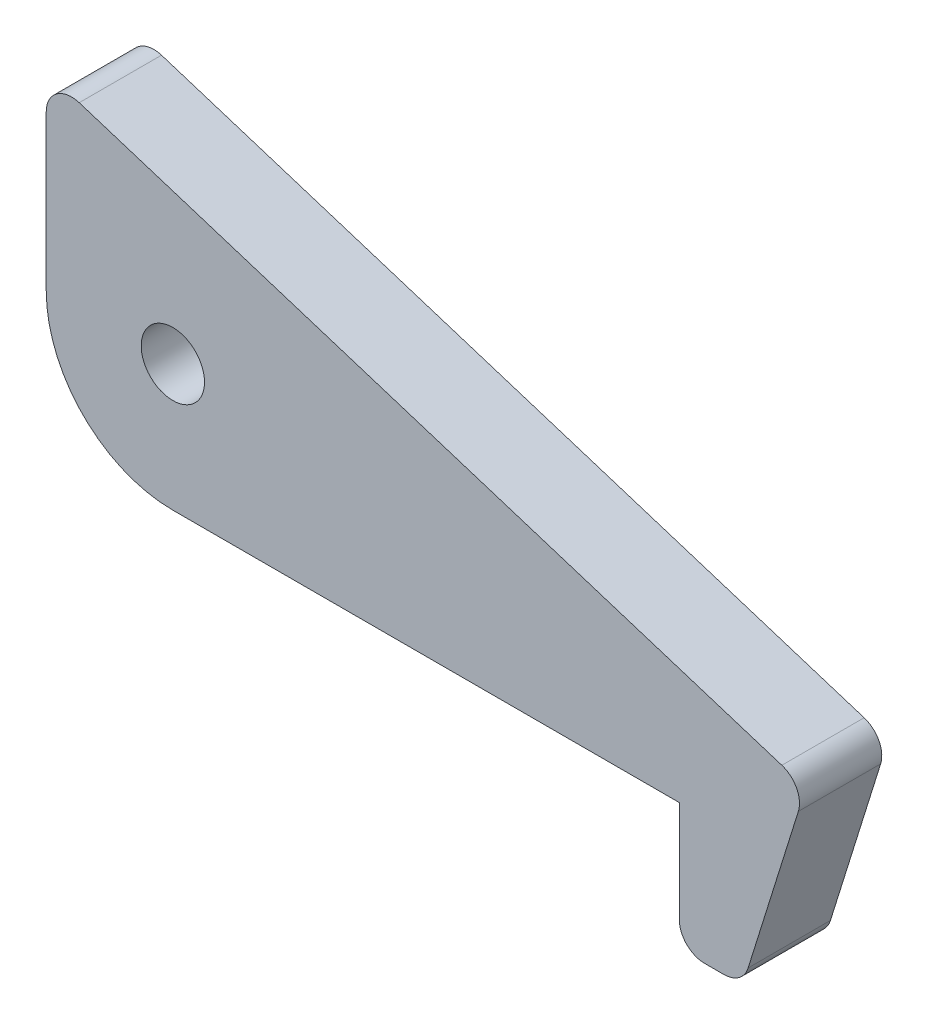
ISO-10303-21;
HEADER;
FILE_DESCRIPTION(('STEP AP214'),'2;1');
FILE_NAME('part.step','',(''),(''),'','','');
FILE_SCHEMA(('AUTOMOTIVE_DESIGN { 1 0 10303 214 1 1 1 1 }'));
ENDSEC;
DATA;
#1=APPLICATION_CONTEXT('core data for automotive mechanical design processes');
#2=APPLICATION_PROTOCOL_DEFINITION('international standard','automotive_design',2000,#1);
#3=PRODUCT_CONTEXT('',#1,'mechanical');
#4=PRODUCT('Part','Part','',(#3));
#5=PRODUCT_RELATED_PRODUCT_CATEGORY('part','',(#4));
#6=PRODUCT_DEFINITION_FORMATION('','',#4);
#7=PRODUCT_DEFINITION_CONTEXT('part definition',#1,'design');
#8=PRODUCT_DEFINITION('design','',#6,#7);
#9=PRODUCT_DEFINITION_SHAPE('','',#8);
#10=(LENGTH_UNIT() NAMED_UNIT(*) SI_UNIT(.MILLI.,.METRE.));
#11=(NAMED_UNIT(*) PLANE_ANGLE_UNIT() SI_UNIT($,.RADIAN.));
#12=(NAMED_UNIT(*) SI_UNIT($,.STERADIAN.) SOLID_ANGLE_UNIT());
#13=UNCERTAINTY_MEASURE_WITH_UNIT(LENGTH_MEASURE(1.E-05),#10,'distance_accuracy_value','');
#14=(GEOMETRIC_REPRESENTATION_CONTEXT(3) GLOBAL_UNCERTAINTY_ASSIGNED_CONTEXT((#13)) GLOBAL_UNIT_ASSIGNED_CONTEXT((#10,
#11,#12)) REPRESENTATION_CONTEXT('',''));
#15=CARTESIAN_POINT('',(0.,0.,0.));
#16=DIRECTION('',(0.,0.,1.));
#17=DIRECTION('',(1.,0.,0.));
#18=AXIS2_PLACEMENT_3D('',#15,#16,#17);
#19=CARTESIAN_POINT('',(0.,0.,6.5));
#20=DIRECTION('',(1.,0.,0.));
#21=DIRECTION('',(0.,0.,-1.));
#22=AXIS2_PLACEMENT_3D('',#19,#20,#21);
#23=PLANE('',#22);
#24=DIRECTION('',(0.,-1.,0.));
#25=VECTOR('',#24,1.);
#26=CARTESIAN_POINT('',(0.,0.,6.5));
#27=LINE('',#26,#25);
#28=CARTESIAN_POINT('',(0.,32.2687841363254,6.5));
#29=VERTEX_POINT('',#28);
#30=CARTESIAN_POINT('',(0.,20.,6.5));
#31=VERTEX_POINT('',#30);
#32=EDGE_CURVE('E144',#29,#31,#27,.T.);
#33=ORIENTED_EDGE('',*,*,#32,.F.);
#34=DIRECTION('',(0.,0.,-1.));
#35=VECTOR('',#34,1.);
#36=CARTESIAN_POINT('',(0.,32.2687841363254,6.5));
#37=LINE('',#36,#35);
#38=CARTESIAN_POINT('',(0.,32.2687841363254,0.));
#39=VERTEX_POINT('',#38);
#40=EDGE_CURVE('E191',#29,#39,#37,.T.);
#41=ORIENTED_EDGE('',*,*,#40,.T.);
#42=DIRECTION('',(0.,-1.,0.));
#43=VECTOR('',#42,1.);
#44=CARTESIAN_POINT('',(0.,0.,0.));
#45=LINE('',#44,#43);
#46=CARTESIAN_POINT('',(0.,20.,0.));
#47=VERTEX_POINT('',#46);
#48=EDGE_CURVE('E134',#39,#47,#45,.T.);
#49=ORIENTED_EDGE('',*,*,#48,.T.);
#50=DIRECTION('',(0.,0.,1.));
#51=VECTOR('',#50,1.);
#52=CARTESIAN_POINT('',(0.,20.,6.5));
#53=LINE('',#52,#51);
#54=EDGE_CURVE('E150',#47,#31,#53,.T.);
#55=ORIENTED_EDGE('',*,*,#54,.T.);
#56=EDGE_LOOP('',(#33,#41,#49,#55));
#57=FACE_BOUND('',#56,.T.);
#58=ADVANCED_FACE('F33',(#57),#23,.F.);
#59=CARTESIAN_POINT('',(0.,0.,6.5));
#60=DIRECTION('',(0.,1.,0.));
#61=DIRECTION('',(0.,0.,1.));
#62=AXIS2_PLACEMENT_3D('',#59,#60,#61);
#63=PLANE('',#62);
#64=DIRECTION('',(1.,0.,0.));
#65=VECTOR('',#64,1.);
#66=CARTESIAN_POINT('',(0.,0.,0.));
#67=LINE('',#66,#65);
#68=CARTESIAN_POINT('',(52.,0.,0.));
#69=VERTEX_POINT('',#68);
#70=CARTESIAN_POINT('',(53.52961817322,0.,0.));
#71=VERTEX_POINT('',#70);
#72=EDGE_CURVE('E147',#69,#71,#67,.T.);
#73=ORIENTED_EDGE('',*,*,#72,.T.);
#74=DIRECTION('',(0.,0.,1.));
#75=VECTOR('',#74,1.);
#76=CARTESIAN_POINT('',(53.52961817322,0.,6.5));
#77=LINE('',#76,#75);
#78=CARTESIAN_POINT('',(53.52961817322,0.,6.5));
#79=VERTEX_POINT('',#78);
#80=EDGE_CURVE('E169',#71,#79,#77,.T.);
#81=ORIENTED_EDGE('',*,*,#80,.T.);
#82=DIRECTION('',(1.,0.,0.));
#83=VECTOR('',#82,1.);
#84=CARTESIAN_POINT('',(0.,0.,6.5));
#85=LINE('',#84,#83);
#86=CARTESIAN_POINT('',(52.,0.,6.5));
#87=VERTEX_POINT('',#86);
#88=EDGE_CURVE('E146',#87,#79,#85,.T.);
#89=ORIENTED_EDGE('',*,*,#88,.F.);
#90=DIRECTION('',(0.,0.,1.));
#91=VECTOR('',#90,1.);
#92=CARTESIAN_POINT('',(52.,0.,6.5));
#93=LINE('',#92,#91);
#94=EDGE_CURVE('E165',#87,#69,#93,.F.);
#95=ORIENTED_EDGE('',*,*,#94,.T.);
#96=EDGE_LOOP('',(#73,#81,#89,#95));
#97=FACE_BOUND('',#96,.T.);
#98=ADVANCED_FACE('F219',(#97),#63,.F.);
#99=CARTESIAN_POINT('',(0.,0.,6.5));
#100=DIRECTION('',(0.,0.,-1.));
#101=DIRECTION('',(-1.,0.,0.));
#102=AXIS2_PLACEMENT_3D('',#99,#100,#101);
#103=PLANE('',#102);
#104=CARTESIAN_POINT('',(10.,20.,6.5));
#105=DIRECTION('',(0.,0.,1.));
#106=DIRECTION('',(1.,0.,0.));
#107=AXIS2_PLACEMENT_3D('',#104,#105,#106);
#108=CIRCLE('',#107,2.5);
#109=CARTESIAN_POINT('',(12.5,20.,6.5));
#110=VERTEX_POINT('',#109);
#111=EDGE_CURVE('E125',#110,#110,#108,.T.);
#112=ORIENTED_EDGE('',*,*,#111,.F.);
#113=EDGE_LOOP('',(#112));
#114=FACE_BOUND('',#113,.T.);
#115=DIRECTION('',(0.953342225350744,-0.301891704694402,0.));
#116=VECTOR('',#115,1.);
#117=CARTESIAN_POINT('',(0.,35.,6.5));
#118=LINE('',#117,#116);
#119=CARTESIAN_POINT('',(2.60378340938881,34.1754685870269,6.5));
#120=VERTEX_POINT('',#119);
#121=CARTESIAN_POINT('',(58.1005309801839,16.6014985229418,6.5));
#122=VERTEX_POINT('',#121);
#123=EDGE_CURVE('E248',#120,#122,#118,.T.);
#124=ORIENTED_EDGE('',*,*,#123,.F.);
#125=CARTESIAN_POINT('',(2.,32.2687841363254,6.5));
#126=DIRECTION('',(0.,0.,-1.));
#127=DIRECTION('',(-1.,0.,0.));
#128=AXIS2_PLACEMENT_3D('',#125,#126,#127);
#129=CIRCLE('',#128,2.);
#130=EDGE_CURVE('E11',#120,#29,#129,.F.);
#131=ORIENTED_EDGE('',*,*,#130,.T.);
#132=ORIENTED_EDGE('',*,*,#32,.T.);
#133=CARTESIAN_POINT('',(10.,20.,6.5));
#134=DIRECTION('',(0.,0.,-1.));
#135=DIRECTION('',(-1.,0.,0.));
#136=AXIS2_PLACEMENT_3D('',#133,#134,#135);
#137=CIRCLE('',#136,10.);
#138=CARTESIAN_POINT('',(9.99999999999999,10.,6.5));
#139=VERTEX_POINT('',#138);
#140=EDGE_CURVE('E138',#31,#139,#137,.F.);
#141=ORIENTED_EDGE('',*,*,#140,.T.);
#142=DIRECTION('',(-1.,0.,0.));
#143=VECTOR('',#142,1.);
#144=CARTESIAN_POINT('',(0.,10.,6.5));
#145=LINE('',#144,#143);
#146=CARTESIAN_POINT('',(50.,10.,6.5));
#147=VERTEX_POINT('',#146);
#148=EDGE_CURVE('E124',#147,#139,#145,.T.);
#149=ORIENTED_EDGE('',*,*,#148,.F.);
#150=DIRECTION('',(0.,1.,0.));
#151=VECTOR('',#150,1.);
#152=CARTESIAN_POINT('',(50.,0.,6.5));
#153=LINE('',#152,#151);
#154=CARTESIAN_POINT('',(50.,2.,6.5));
#155=VERTEX_POINT('',#154);
#156=EDGE_CURVE('E115',#155,#147,#153,.T.);
#157=ORIENTED_EDGE('',*,*,#156,.F.);
#158=CARTESIAN_POINT('',(52.,2.,6.5));
#159=DIRECTION('',(0.,0.,-1.));
#160=DIRECTION('',(-1.,0.,0.));
#161=AXIS2_PLACEMENT_3D('',#158,#159,#160);
#162=CIRCLE('',#161,2.);
#163=EDGE_CURVE('E163',#155,#87,#162,.F.);
#164=ORIENTED_EDGE('',*,*,#163,.T.);
#165=ORIENTED_EDGE('',*,*,#88,.T.);
#166=CARTESIAN_POINT('',(53.52961817322,2.,6.5));
#167=DIRECTION('',(0.,0.,-1.));
#168=DIRECTION('',(-1.,0.,0.));
#169=AXIS2_PLACEMENT_3D('',#166,#167,#168);
#170=CIRCLE('',#169,2.);
#171=CARTESIAN_POINT('',(55.43857812929,1.4034500137281,6.5));
#172=VERTEX_POINT('',#171);
#173=EDGE_CURVE('E172',#79,#172,#170,.F.);
#174=ORIENTED_EDGE('',*,*,#173,.T.);
#175=DIRECTION('',(-0.298274993135947,-0.95447997803503,0.));
#176=VECTOR('',#175,1.);
#177=CARTESIAN_POINT('',(55.,0.,6.5));
#178=LINE('',#177,#176);
#179=CARTESIAN_POINT('',(59.4057075268651,14.0982640859684,6.5));
#180=VERTEX_POINT('',#179);
#181=EDGE_CURVE('E247',#180,#172,#178,.T.);
#182=ORIENTED_EDGE('',*,*,#181,.F.);
#183=CARTESIAN_POINT('',(57.4967475707951,14.6948140722403,6.5));
#184=DIRECTION('',(0.,0.,-1.));
#185=DIRECTION('',(-1.,0.,0.));
#186=AXIS2_PLACEMENT_3D('',#183,#184,#185);
#187=CIRCLE('',#186,2.);
#188=EDGE_CURVE('E183',#180,#122,#187,.F.);
#189=ORIENTED_EDGE('',*,*,#188,.T.);
#190=EDGE_LOOP('',(#124,#131,#132,#141,#149,#157,#164,#165,#174,#182,#189));
#191=FACE_BOUND('',#190,.T.);
#192=ADVANCED_FACE('F136',(#114,#191),#103,.F.);
#193=CARTESIAN_POINT('',(0.,0.,0.));
#194=DIRECTION('',(0.,0.,-1.));
#195=DIRECTION('',(-1.,0.,0.));
#196=AXIS2_PLACEMENT_3D('',#193,#194,#195);
#197=PLANE('',#196);
#198=ORIENTED_EDGE('',*,*,#48,.F.);
#199=CARTESIAN_POINT('',(2.,32.2687841363254,0.));
#200=DIRECTION('',(0.,0.,-1.));
#201=DIRECTION('',(-1.,0.,0.));
#202=AXIS2_PLACEMENT_3D('',#199,#200,#201);
#203=CIRCLE('',#202,2.);
#204=CARTESIAN_POINT('',(2.60378340938881,34.1754685870269,0.));
#205=VERTEX_POINT('',#204);
#206=EDGE_CURVE('E55',#39,#205,#203,.T.);
#207=ORIENTED_EDGE('',*,*,#206,.T.);
#208=DIRECTION('',(0.953342225350744,-0.301891704694402,0.));
#209=VECTOR('',#208,1.);
#210=CARTESIAN_POINT('',(0.,35.,0.));
#211=LINE('',#210,#209);
#212=CARTESIAN_POINT('',(58.1005309801839,16.6014985229418,0.));
#213=VERTEX_POINT('',#212);
#214=EDGE_CURVE('E244',#205,#213,#211,.T.);
#215=ORIENTED_EDGE('',*,*,#214,.T.);
#216=CARTESIAN_POINT('',(57.4967475707951,14.6948140722403,0.));
#217=DIRECTION('',(0.,0.,-1.));
#218=DIRECTION('',(-1.,0.,0.));
#219=AXIS2_PLACEMENT_3D('',#216,#217,#218);
#220=CIRCLE('',#219,2.);
#221=CARTESIAN_POINT('',(59.4057075268651,14.0982640859684,0.));
#222=VERTEX_POINT('',#221);
#223=EDGE_CURVE('E189',#213,#222,#220,.T.);
#224=ORIENTED_EDGE('',*,*,#223,.T.);
#225=DIRECTION('',(-0.298274993135947,-0.95447997803503,0.));
#226=VECTOR('',#225,1.);
#227=CARTESIAN_POINT('',(55.,0.,0.));
#228=LINE('',#227,#226);
#229=CARTESIAN_POINT('',(55.43857812929,1.4034500137281,0.));
#230=VERTEX_POINT('',#229);
#231=EDGE_CURVE('E253',#222,#230,#228,.T.);
#232=ORIENTED_EDGE('',*,*,#231,.T.);
#233=CARTESIAN_POINT('',(53.52961817322,2.,0.));
#234=DIRECTION('',(0.,0.,-1.));
#235=DIRECTION('',(-1.,0.,0.));
#236=AXIS2_PLACEMENT_3D('',#233,#234,#235);
#237=CIRCLE('',#236,2.);
#238=EDGE_CURVE('E178',#230,#71,#237,.T.);
#239=ORIENTED_EDGE('',*,*,#238,.T.);
#240=ORIENTED_EDGE('',*,*,#72,.F.);
#241=CARTESIAN_POINT('',(52.,2.,0.));
#242=DIRECTION('',(0.,0.,-1.));
#243=DIRECTION('',(-1.,0.,0.));
#244=AXIS2_PLACEMENT_3D('',#241,#242,#243);
#245=CIRCLE('',#244,2.);
#246=CARTESIAN_POINT('',(50.,2.,0.));
#247=VERTEX_POINT('',#246);
#248=EDGE_CURVE('E167',#69,#247,#245,.T.);
#249=ORIENTED_EDGE('',*,*,#248,.T.);
#250=DIRECTION('',(0.,1.,0.));
#251=VECTOR('',#250,1.);
#252=CARTESIAN_POINT('',(50.,0.,0.));
#253=LINE('',#252,#251);
#254=CARTESIAN_POINT('',(50.,10.,0.));
#255=VERTEX_POINT('',#254);
#256=EDGE_CURVE('E139',#247,#255,#253,.T.);
#257=ORIENTED_EDGE('',*,*,#256,.T.);
#258=DIRECTION('',(-1.,0.,0.));
#259=VECTOR('',#258,1.);
#260=CARTESIAN_POINT('',(0.,10.,0.));
#261=LINE('',#260,#259);
#262=CARTESIAN_POINT('',(9.99999999999999,10.,0.));
#263=VERTEX_POINT('',#262);
#264=EDGE_CURVE('E133',#255,#263,#261,.T.);
#265=ORIENTED_EDGE('',*,*,#264,.T.);
#266=CARTESIAN_POINT('',(10.,20.,0.));
#267=DIRECTION('',(0.,0.,-1.));
#268=DIRECTION('',(-1.,0.,0.));
#269=AXIS2_PLACEMENT_3D('',#266,#267,#268);
#270=CIRCLE('',#269,10.);
#271=EDGE_CURVE('E159',#263,#47,#270,.T.);
#272=ORIENTED_EDGE('',*,*,#271,.T.);
#273=EDGE_LOOP('',(#198,#207,#215,#224,#232,#239,#240,#249,#257,#265,#272));
#274=FACE_BOUND('',#273,.T.);
#275=CARTESIAN_POINT('',(10.,20.,0.));
#276=DIRECTION('',(0.,0.,-1.));
#277=DIRECTION('',(-1.,0.,0.));
#278=AXIS2_PLACEMENT_3D('',#275,#276,#277);
#279=CIRCLE('',#278,2.5);
#280=CARTESIAN_POINT('',(12.5,20.,0.));
#281=VERTEX_POINT('',#280);
#282=EDGE_CURVE('E255',#281,#281,#279,.F.);
#283=ORIENTED_EDGE('',*,*,#282,.T.);
#284=EDGE_LOOP('',(#283));
#285=FACE_BOUND('',#284,.T.);
#286=ADVANCED_FACE('F199',(#274,#285),#197,.T.);
#287=CARTESIAN_POINT('',(0.,10.,0.));
#288=DIRECTION('',(0.,1.,0.));
#289=DIRECTION('',(0.,0.,1.));
#290=AXIS2_PLACEMENT_3D('',#287,#288,#289);
#291=PLANE('',#290);
#292=ORIENTED_EDGE('',*,*,#148,.T.);
#293=DIRECTION('',(0.,0.,1.));
#294=VECTOR('',#293,1.);
#295=CARTESIAN_POINT('',(10.,10.,0.));
#296=LINE('',#295,#294);
#297=EDGE_CURVE('E157',#139,#263,#296,.F.);
#298=ORIENTED_EDGE('',*,*,#297,.T.);
#299=ORIENTED_EDGE('',*,*,#264,.F.);
#300=DIRECTION('',(0.,0.,1.));
#301=VECTOR('',#300,1.);
#302=CARTESIAN_POINT('',(50.,10.,0.));
#303=LINE('',#302,#301);
#304=EDGE_CURVE('E119',#255,#147,#303,.T.);
#305=ORIENTED_EDGE('',*,*,#304,.T.);
#306=EDGE_LOOP('',(#292,#298,#299,#305));
#307=FACE_BOUND('',#306,.T.);
#308=ADVANCED_FACE('F130',(#307),#291,.F.);
#309=CARTESIAN_POINT('',(50.,0.,0.));
#310=DIRECTION('',(1.,0.,0.));
#311=DIRECTION('',(0.,0.,-1.));
#312=AXIS2_PLACEMENT_3D('',#309,#310,#311);
#313=PLANE('',#312);
#314=ORIENTED_EDGE('',*,*,#256,.F.);
#315=DIRECTION('',(0.,0.,1.));
#316=VECTOR('',#315,1.);
#317=CARTESIAN_POINT('',(50.,2.,0.));
#318=LINE('',#317,#316);
#319=EDGE_CURVE('E121',#247,#155,#318,.T.);
#320=ORIENTED_EDGE('',*,*,#319,.T.);
#321=ORIENTED_EDGE('',*,*,#156,.T.);
#322=ORIENTED_EDGE('',*,*,#304,.F.);
#323=EDGE_LOOP('',(#314,#320,#321,#322));
#324=FACE_BOUND('',#323,.T.);
#325=ADVANCED_FACE('F118',(#324),#313,.F.);
#326=CARTESIAN_POINT('',(10.,20.,6.5));
#327=DIRECTION('',(0.,0.,1.));
#328=DIRECTION('',(1.,0.,0.));
#329=AXIS2_PLACEMENT_3D('',#326,#327,#328);
#330=CYLINDRICAL_SURFACE('',#329,10.);
#331=ORIENTED_EDGE('',*,*,#271,.F.);
#332=ORIENTED_EDGE('',*,*,#297,.F.);
#333=ORIENTED_EDGE('',*,*,#140,.F.);
#334=ORIENTED_EDGE('',*,*,#54,.F.);
#335=EDGE_LOOP('',(#331,#332,#333,#334));
#336=FACE_BOUND('',#335,.T.);
#337=ADVANCED_FACE('F204',(#336),#330,.T.);
#338=CARTESIAN_POINT('',(10.,20.,-0.00100000000000013));
#339=DIRECTION('',(0.,0.,1.));
#340=DIRECTION('',(1.,0.,0.));
#341=AXIS2_PLACEMENT_3D('',#338,#339,#340);
#342=CYLINDRICAL_SURFACE('',#341,2.5);
#343=CARTESIAN_POINT('',(12.5,20.,0.));
#344=CARTESIAN_POINT('',(12.5,20.,0.0677083333333333));
#345=CARTESIAN_POINT('',(12.5,20.,0.135416666666667));
#346=CARTESIAN_POINT('',(12.5,20.,0.270833333333333));
#347=CARTESIAN_POINT('',(12.5,20.,0.338541666666667));
#348=CARTESIAN_POINT('',(12.5,20.,0.473958333333333));
#349=CARTESIAN_POINT('',(12.5,20.,0.541666666666667));
#350=CARTESIAN_POINT('',(12.5,20.,0.677083333333333));
#351=CARTESIAN_POINT('',(12.5,20.,0.744791666666667));
#352=CARTESIAN_POINT('',(12.5,20.,0.880208333333333));
#353=CARTESIAN_POINT('',(12.5,20.,0.947916666666666));
#354=CARTESIAN_POINT('',(12.5,20.,1.08333333333333));
#355=CARTESIAN_POINT('',(12.5,20.,1.15104166666667));
#356=CARTESIAN_POINT('',(12.5,20.,1.28645833333333));
#357=CARTESIAN_POINT('',(12.5,20.,1.35416666666667));
#358=CARTESIAN_POINT('',(12.5,20.,1.48958333333333));
#359=CARTESIAN_POINT('',(12.5,20.,1.55729166666667));
#360=CARTESIAN_POINT('',(12.5,20.,1.69270833333333));
#361=CARTESIAN_POINT('',(12.5,20.,1.76041666666667));
#362=CARTESIAN_POINT('',(12.5,20.,1.89583333333333));
#363=CARTESIAN_POINT('',(12.5,20.,1.96354166666667));
#364=CARTESIAN_POINT('',(12.5,20.,2.09895833333333));
#365=CARTESIAN_POINT('',(12.5,20.,2.16666666666667));
#366=CARTESIAN_POINT('',(12.5,20.,2.30208333333333));
#367=CARTESIAN_POINT('',(12.5,20.,2.36979166666667));
#368=CARTESIAN_POINT('',(12.5,20.,2.50520833333333));
#369=CARTESIAN_POINT('',(12.5,20.,2.57291666666667));
#370=CARTESIAN_POINT('',(12.5,20.,2.70833333333333));
#371=CARTESIAN_POINT('',(12.5,20.,2.77604166666667));
#372=CARTESIAN_POINT('',(12.5,20.,2.91145833333333));
#373=CARTESIAN_POINT('',(12.5,20.,2.97916666666667));
#374=CARTESIAN_POINT('',(12.5,20.,3.11458333333333));
#375=CARTESIAN_POINT('',(12.5,20.,3.18229166666667));
#376=CARTESIAN_POINT('',(12.5,20.,3.31770833333333));
#377=CARTESIAN_POINT('',(12.5,20.,3.38541666666667));
#378=CARTESIAN_POINT('',(12.5,20.,3.52083333333333));
#379=CARTESIAN_POINT('',(12.5,20.,3.58854166666667));
#380=CARTESIAN_POINT('',(12.5,20.,3.72395833333333));
#381=CARTESIAN_POINT('',(12.5,20.,3.79166666666667));
#382=CARTESIAN_POINT('',(12.5,20.,3.92708333333333));
#383=CARTESIAN_POINT('',(12.5,20.,3.99479166666667));
#384=CARTESIAN_POINT('',(12.5,20.,4.13020833333333));
#385=CARTESIAN_POINT('',(12.5,20.,4.19791666666667));
#386=CARTESIAN_POINT('',(12.5,20.,4.33333333333333));
#387=CARTESIAN_POINT('',(12.5,20.,4.40104166666667));
#388=CARTESIAN_POINT('',(12.5,20.,4.53645833333333));
#389=CARTESIAN_POINT('',(12.5,20.,4.60416666666667));
#390=CARTESIAN_POINT('',(12.5,20.,4.73958333333333));
#391=CARTESIAN_POINT('',(12.5,20.,4.80729166666667));
#392=CARTESIAN_POINT('',(12.5,20.,4.94270833333333));
#393=CARTESIAN_POINT('',(12.5,20.,5.01041666666667));
#394=CARTESIAN_POINT('',(12.5,20.,5.14583333333333));
#395=CARTESIAN_POINT('',(12.5,20.,5.21354166666667));
#396=CARTESIAN_POINT('',(12.5,20.,5.34895833333333));
#397=CARTESIAN_POINT('',(12.5,20.,5.41666666666667));
#398=CARTESIAN_POINT('',(12.5,20.,5.55208333333333));
#399=CARTESIAN_POINT('',(12.5,20.,5.61979166666667));
#400=CARTESIAN_POINT('',(12.5,20.,5.75520833333333));
#401=CARTESIAN_POINT('',(12.5,20.,5.82291666666667));
#402=CARTESIAN_POINT('',(12.5,20.,5.95833333333333));
#403=CARTESIAN_POINT('',(12.5,20.,6.02604166666667));
#404=CARTESIAN_POINT('',(12.5,20.,6.16145833333333));
#405=CARTESIAN_POINT('',(12.5,20.,6.22916666666667));
#406=CARTESIAN_POINT('',(12.5,20.,6.36458333333333));
#407=CARTESIAN_POINT('',(12.5,20.,6.43229166666667));
#408=CARTESIAN_POINT('',(12.5,20.,6.5));
#409=B_SPLINE_CURVE_WITH_KNOTS('',3,(#343,#344,#345,#346,#347,#348,#349,#350,#351,#352,#353,
#354,#355,#356,#357,#358,#359,#360,#361,#362,#363,#364,#365,#366,#367,#368,#369,#370,#371,#372,
#373,#374,#375,#376,#377,#378,#379,#380,#381,#382,#383,#384,#385,#386,#387,#388,#389,#390,#391,
#392,#393,#394,#395,#396,#397,#398,#399,#400,#401,#402,#403,#404,#405,#406,#407,#408),
.UNSPECIFIED.,.F.,.F.,(4,2,2,2,2,2,2,2,2,2,2,2,2,2,2,2,2,2,2,2,2,2,2,2,2,2,2,2,2,2,2,2,4),(0.,
0.203125,0.40625,0.609375,0.8125,1.015625,1.21875,1.421875,1.625,1.828125,2.03125,2.234375,
2.4375,2.640625,2.84375,3.046875,3.25,3.453125,3.65625,3.859375,4.0625,4.265625,4.46875,
4.671875,4.875,5.078125,5.28125,5.484375,5.6875,5.890625,6.09375,6.296875,6.5),.UNSPECIFIED.);
#410=EDGE_CURVE('BSEAM206',#281,#110,#409,.T.);
#411=ORIENTED_EDGE('',*,*,#282,.F.);
#412=ORIENTED_EDGE('',*,*,#111,.T.);
#413=ORIENTED_EDGE('',*,*,#410,.T.);
#414=ORIENTED_EDGE('',*,*,#410,.F.);
#415=EDGE_LOOP('',(#411,#413,#412,#414));
#416=FACE_BOUND('',#415,.T.);
#417=ADVANCED_FACE('F206',(#416),#342,.F.);
#418=CARTESIAN_POINT('',(55.,0.,0.));
#419=DIRECTION('',(-0.95447997803503,0.298274993135947,0.));
#420=DIRECTION('',(-0.298274993135947,-0.95447997803503,0.));
#421=AXIS2_PLACEMENT_3D('',#418,#419,#420);
#422=PLANE('',#421);
#423=ORIENTED_EDGE('',*,*,#231,.F.);
#424=DIRECTION('',(0.,0.,1.));
#425=VECTOR('',#424,1.);
#426=CARTESIAN_POINT('',(59.4057075268651,14.0982640859684,0.));
#427=LINE('',#426,#425);
#428=EDGE_CURVE('E180',#222,#180,#427,.T.);
#429=ORIENTED_EDGE('',*,*,#428,.T.);
#430=ORIENTED_EDGE('',*,*,#181,.T.);
#431=DIRECTION('',(0.,0.,1.));
#432=VECTOR('',#431,1.);
#433=CARTESIAN_POINT('',(55.43857812929,1.40345001372811,0.));
#434=LINE('',#433,#432);
#435=EDGE_CURVE('E175',#172,#230,#434,.F.);
#436=ORIENTED_EDGE('',*,*,#435,.T.);
#437=EDGE_LOOP('',(#423,#429,#430,#436));
#438=FACE_BOUND('',#437,.T.);
#439=ADVANCED_FACE('F212',(#438),#422,.F.);
#440=CARTESIAN_POINT('',(0.,35.,0.));
#441=DIRECTION('',(-0.301891704694402,-0.953342225350744,0.));
#442=DIRECTION('',(0.953342225350744,-0.301891704694402,0.));
#443=AXIS2_PLACEMENT_3D('',#440,#441,#442);
#444=PLANE('',#443);
#445=ORIENTED_EDGE('',*,*,#214,.F.);
#446=DIRECTION('',(0.,0.,-1.));
#447=VECTOR('',#446,1.);
#448=CARTESIAN_POINT('',(2.60378340938881,34.1754685870269,0.));
#449=LINE('',#448,#447);
#450=EDGE_CURVE('E41',#205,#120,#449,.F.);
#451=ORIENTED_EDGE('',*,*,#450,.T.);
#452=ORIENTED_EDGE('',*,*,#123,.T.);
#453=DIRECTION('',(0.,0.,1.));
#454=VECTOR('',#453,1.);
#455=CARTESIAN_POINT('',(58.1005309801839,16.6014985229418,0.));
#456=LINE('',#455,#454);
#457=EDGE_CURVE('E186',#122,#213,#456,.F.);
#458=ORIENTED_EDGE('',*,*,#457,.T.);
#459=EDGE_LOOP('',(#445,#451,#452,#458));
#460=FACE_BOUND('',#459,.T.);
#461=ADVANCED_FACE('F235',(#460),#444,.F.);
#462=CARTESIAN_POINT('',(52.,2.,0.));
#463=DIRECTION('',(0.,0.,1.));
#464=DIRECTION('',(1.,0.,0.));
#465=AXIS2_PLACEMENT_3D('',#462,#463,#464);
#466=CYLINDRICAL_SURFACE('',#465,2.);
#467=ORIENTED_EDGE('',*,*,#248,.F.);
#468=ORIENTED_EDGE('',*,*,#94,.F.);
#469=ORIENTED_EDGE('',*,*,#163,.F.);
#470=ORIENTED_EDGE('',*,*,#319,.F.);
#471=EDGE_LOOP('',(#467,#468,#469,#470));
#472=FACE_BOUND('',#471,.T.);
#473=ADVANCED_FACE('F238',(#472),#466,.T.);
#474=CARTESIAN_POINT('',(53.52961817322,2.,6.5));
#475=DIRECTION('',(0.,0.,1.));
#476=DIRECTION('',(1.,0.,0.));
#477=AXIS2_PLACEMENT_3D('',#474,#475,#476);
#478=CYLINDRICAL_SURFACE('',#477,2.);
#479=ORIENTED_EDGE('',*,*,#238,.F.);
#480=ORIENTED_EDGE('',*,*,#435,.F.);
#481=ORIENTED_EDGE('',*,*,#173,.F.);
#482=ORIENTED_EDGE('',*,*,#80,.F.);
#483=EDGE_LOOP('',(#479,#480,#481,#482));
#484=FACE_BOUND('',#483,.T.);
#485=ADVANCED_FACE('F242',(#484),#478,.T.);
#486=CARTESIAN_POINT('',(57.4967475707951,14.6948140722403,0.));
#487=DIRECTION('',(0.,0.,1.));
#488=DIRECTION('',(1.,0.,0.));
#489=AXIS2_PLACEMENT_3D('',#486,#487,#488);
#490=CYLINDRICAL_SURFACE('',#489,2.);
#491=ORIENTED_EDGE('',*,*,#223,.F.);
#492=ORIENTED_EDGE('',*,*,#457,.F.);
#493=ORIENTED_EDGE('',*,*,#188,.F.);
#494=ORIENTED_EDGE('',*,*,#428,.F.);
#495=EDGE_LOOP('',(#491,#492,#493,#494));
#496=FACE_BOUND('',#495,.T.);
#497=ADVANCED_FACE('F274',(#496),#490,.T.);
#498=CARTESIAN_POINT('',(2.,32.2687841363254,6.5));
#499=DIRECTION('',(0.,0.,-1.));
#500=DIRECTION('',(-1.,0.,0.));
#501=AXIS2_PLACEMENT_3D('',#498,#499,#500);
#502=CYLINDRICAL_SURFACE('',#501,2.);
#503=ORIENTED_EDGE('',*,*,#130,.F.);
#504=ORIENTED_EDGE('',*,*,#450,.F.);
#505=ORIENTED_EDGE('',*,*,#206,.F.);
#506=ORIENTED_EDGE('',*,*,#40,.F.);
#507=EDGE_LOOP('',(#503,#504,#505,#506));
#508=FACE_BOUND('',#507,.T.);
#509=ADVANCED_FACE('F35',(#508),#502,.T.);
#510=CLOSED_SHELL('',(#58,#98,#192,#286,#308,#325,#337,#417,#439,#461,#473,#485,#497,#509));
#511=MANIFOLD_SOLID_BREP('B2',#510);
#512=ADVANCED_BREP_SHAPE_REPRESENTATION('',(#18,#511),#14);
#513=SHAPE_DEFINITION_REPRESENTATION(#9,#512);
ENDSEC;
END-ISO-10303-21;
